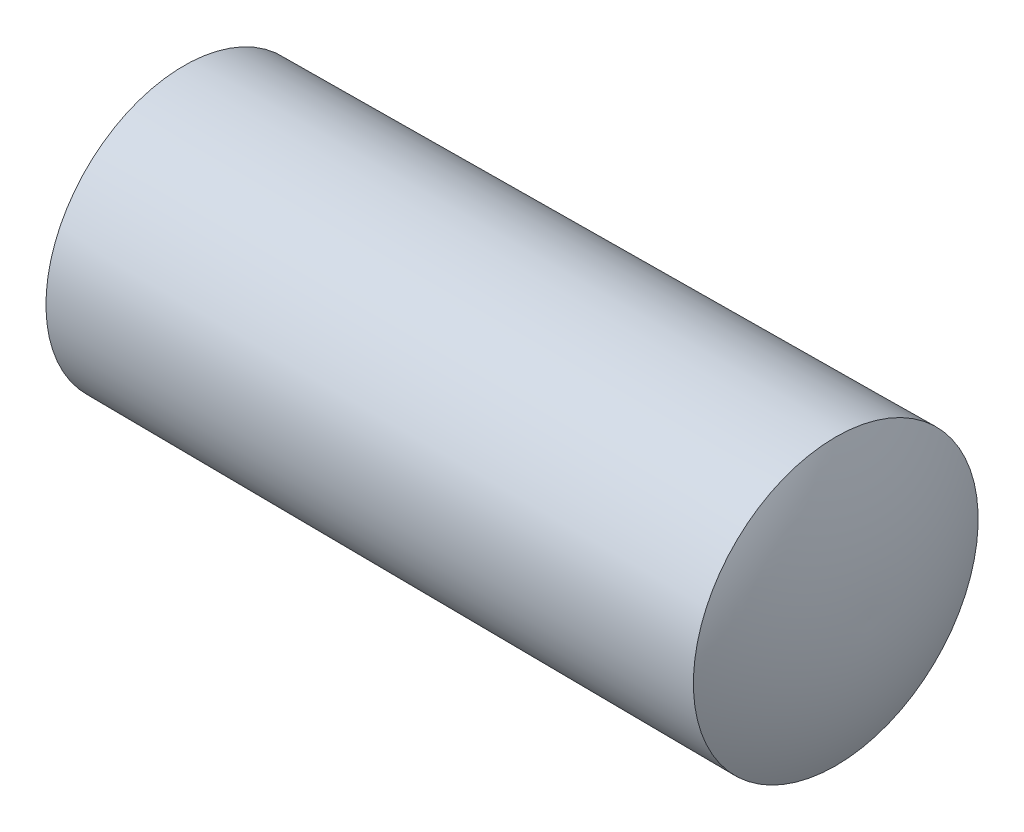
ISO-10303-21;
HEADER;
FILE_DESCRIPTION(('STEP AP214'),'2;1');
FILE_NAME('part.step','',(''),(''),'','','');
FILE_SCHEMA(('AUTOMOTIVE_DESIGN { 1 0 10303 214 1 1 1 1 }'));
ENDSEC;
DATA;
#1=APPLICATION_CONTEXT('core data for automotive mechanical design processes');
#2=APPLICATION_PROTOCOL_DEFINITION('international standard','automotive_design',2000,#1);
#3=PRODUCT_CONTEXT('',#1,'mechanical');
#4=PRODUCT('Part','Part','',(#3));
#5=PRODUCT_RELATED_PRODUCT_CATEGORY('part','',(#4));
#6=PRODUCT_DEFINITION_FORMATION('','',#4);
#7=PRODUCT_DEFINITION_CONTEXT('part definition',#1,'design');
#8=PRODUCT_DEFINITION('design','',#6,#7);
#9=PRODUCT_DEFINITION_SHAPE('','',#8);
#10=(LENGTH_UNIT() NAMED_UNIT(*) SI_UNIT(.MILLI.,.METRE.));
#11=(NAMED_UNIT(*) PLANE_ANGLE_UNIT() SI_UNIT($,.RADIAN.));
#12=(NAMED_UNIT(*) SI_UNIT($,.STERADIAN.) SOLID_ANGLE_UNIT());
#13=UNCERTAINTY_MEASURE_WITH_UNIT(LENGTH_MEASURE(1.E-05),#10,'distance_accuracy_value','');
#14=(GEOMETRIC_REPRESENTATION_CONTEXT(3) GLOBAL_UNCERTAINTY_ASSIGNED_CONTEXT((#13)) GLOBAL_UNIT_ASSIGNED_CONTEXT((#10,
#11,#12)) REPRESENTATION_CONTEXT('',''));
#15=CARTESIAN_POINT('',(0.,0.,0.));
#16=DIRECTION('',(0.,0.,1.));
#17=DIRECTION('',(1.,0.,0.));
#18=AXIS2_PLACEMENT_3D('',#15,#16,#17);
#19=CARTESIAN_POINT('',(9.99700518810621,-0.244718754854509,0.));
#20=DIRECTION('',(0.,0.,-1.));
#21=DIRECTION('',(0.,-1.,0.));
#22=AXIS2_PLACEMENT_3D('',#19,#20,#21);
#23=CIRCLE('',#22,10.);
#24=TRIMMED_CURVE('',#23,(PARAMETER_VALUE(-1.59527064552849)),
(PARAMETER_VALUE(1.59527064552849)),.T.,.PARAMETER.);
#25=CARTESIAN_POINT('',(9.99700518810621,0.,0.));
#26=DIRECTION('',(-1.,0.,0.));
#27=AXIS1_PLACEMENT('',#25,#26);
#28=SURFACE_OF_REVOLUTION('',#24,#27);
#29=CARTESIAN_POINT('',(1.2,0.,0.));
#30=DIRECTION('',(-1.,0.,0.));
#31=DIRECTION('',(0.,-1.,0.));
#32=AXIS2_PLACEMENT_3D('',#29,#30,#31);
#33=CIRCLE('',#32,5.);
#34=CARTESIAN_POINT('',(1.2,-5.,0.));
#35=VERTEX_POINT('',#34);
#36=EDGE_CURVE('E11',#35,#35,#33,.T.);
#37=ORIENTED_EDGE('',*,*,#36,.T.);
#38=EDGE_LOOP('',(#37));
#39=FACE_BOUND('',#38,.T.);
#40=CARTESIAN_POINT('',(0.,0.,0.));
#41=VERTEX_POINT('',#40);
#42=VERTEX_LOOP('',#41);
#43=FACE_BOUND('',#42,.T.);
#44=ADVANCED_FACE('F44',(#39,#43),#28,.T.);
#45=CARTESIAN_POINT('',(1.2,0.,0.));
#46=DIRECTION('',(1.,0.,0.));
#47=DIRECTION('',(0.,1.,0.));
#48=AXIS2_PLACEMENT_3D('',#45,#46,#47);
#49=CONICAL_SURFACE('',#48,5.,0.00661025085519417);
#50=CARTESIAN_POINT('',(24.8,0.,0.));
#51=DIRECTION('',(-1.,0.,0.));
#52=DIRECTION('',(0.,-1.,0.));
#53=AXIS2_PLACEMENT_3D('',#50,#51,#52);
#54=CIRCLE('',#53,5.15600419241192);
#55=CARTESIAN_POINT('',(24.8,-5.15600419241192,0.));
#56=VERTEX_POINT('',#55);
#57=EDGE_CURVE('E52',#56,#56,#54,.T.);
#58=ORIENTED_EDGE('',*,*,#57,.T.);
#59=EDGE_LOOP('',(#58));
#60=FACE_BOUND('',#59,.T.);
#61=ORIENTED_EDGE('',*,*,#36,.F.);
#62=EDGE_LOOP('',(#61));
#63=FACE_BOUND('',#62,.T.);
#64=ADVANCED_FACE('F61',(#60,#63),#49,.T.);
#65=CARTESIAN_POINT('',(15.3746510915892,-0.244718754854509,0.));
#66=DIRECTION('',(0.,0.,-1.));
#67=DIRECTION('',(0.,-1.,0.));
#68=AXIS2_PLACEMENT_3D('',#65,#66,#67);
#69=CIRCLE('',#68,10.6281666666667);
#70=TRIMMED_CURVE('',#69,(PARAMETER_VALUE(-1.59382385276243)),
(PARAMETER_VALUE(1.59382385276243)),.T.,.PARAMETER.);
#71=CARTESIAN_POINT('',(15.3746510915892,0.,0.));
#72=DIRECTION('',(-1.,0.,0.));
#73=AXIS1_PLACEMENT('',#71,#72);
#74=SURFACE_OF_REVOLUTION('',#70,#73);
#75=CARTESIAN_POINT('',(26.,0.,0.));
#76=VERTEX_POINT('',#75);
#77=VERTEX_LOOP('',#76);
#78=FACE_BOUND('',#77,.T.);
#79=ORIENTED_EDGE('',*,*,#57,.F.);
#80=EDGE_LOOP('',(#79));
#81=FACE_BOUND('',#80,.T.);
#82=ADVANCED_FACE('F58',(#78,#81),#74,.T.);
#83=CLOSED_SHELL('',(#44,#64,#82));
#84=MANIFOLD_SOLID_BREP('B2',#83);
#85=ADVANCED_BREP_SHAPE_REPRESENTATION('',(#18,#84),#14);
#86=SHAPE_DEFINITION_REPRESENTATION(#9,#85);
ENDSEC;
END-ISO-10303-21;
